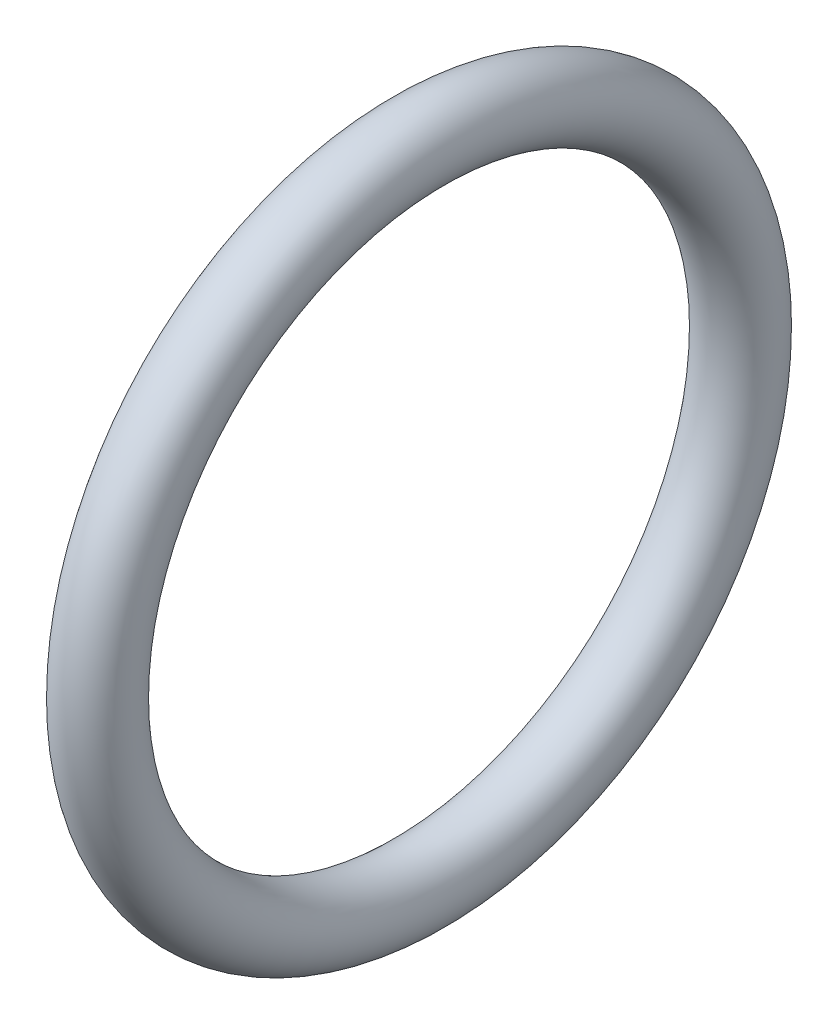
ISO-10303-21;
HEADER;
FILE_DESCRIPTION(('STEP AP214'),'2;1');
FILE_NAME('part.step','',(''),(''),'','','');
FILE_SCHEMA(('AUTOMOTIVE_DESIGN { 1 0 10303 214 1 1 1 1 }'));
ENDSEC;
DATA;
#1=APPLICATION_CONTEXT('core data for automotive mechanical design processes');
#2=APPLICATION_PROTOCOL_DEFINITION('international standard','automotive_design',2000,#1);
#3=PRODUCT_CONTEXT('',#1,'mechanical');
#4=PRODUCT('Part','Part','',(#3));
#5=PRODUCT_RELATED_PRODUCT_CATEGORY('part','',(#4));
#6=PRODUCT_DEFINITION_FORMATION('','',#4);
#7=PRODUCT_DEFINITION_CONTEXT('part definition',#1,'design');
#8=PRODUCT_DEFINITION('design','',#6,#7);
#9=PRODUCT_DEFINITION_SHAPE('','',#8);
#10=(LENGTH_UNIT() NAMED_UNIT(*) SI_UNIT(.MILLI.,.METRE.));
#11=(NAMED_UNIT(*) PLANE_ANGLE_UNIT() SI_UNIT($,.RADIAN.));
#12=(NAMED_UNIT(*) SI_UNIT($,.STERADIAN.) SOLID_ANGLE_UNIT());
#13=UNCERTAINTY_MEASURE_WITH_UNIT(LENGTH_MEASURE(1.E-05),#10,'distance_accuracy_value','');
#14=(GEOMETRIC_REPRESENTATION_CONTEXT(3) GLOBAL_UNCERTAINTY_ASSIGNED_CONTEXT((#13)) GLOBAL_UNIT_ASSIGNED_CONTEXT((#10,
#11,#12)) REPRESENTATION_CONTEXT('',''));
#15=CARTESIAN_POINT('',(0.,0.,0.));
#16=DIRECTION('',(0.,0.,1.));
#17=DIRECTION('',(1.,0.,0.));
#18=AXIS2_PLACEMENT_3D('',#15,#16,#17);
#19=CARTESIAN_POINT('',(0.,0.,0.));
#20=DIRECTION('',(-1.,0.,0.));
#21=DIRECTION('',(0.,0.,1.));
#22=AXIS2_PLACEMENT_3D('',#19,#20,#21);
#23=TOROIDAL_SURFACE('',#22,14.25,1.6);
#24=CARTESIAN_POINT('',(0.,0.,15.85));
#25=VERTEX_POINT('',#24);
#26=VERTEX_LOOP('',#25);
#27=FACE_BOUND('',#26,.T.);
#28=ADVANCED_FACE('F30',(#27),#23,.T.);
#29=CLOSED_SHELL('',(#28));
#30=MANIFOLD_SOLID_BREP('B2',#29);
#31=ADVANCED_BREP_SHAPE_REPRESENTATION('',(#18,#30),#14);
#32=SHAPE_DEFINITION_REPRESENTATION(#9,#31);
ENDSEC;
END-ISO-10303-21;
